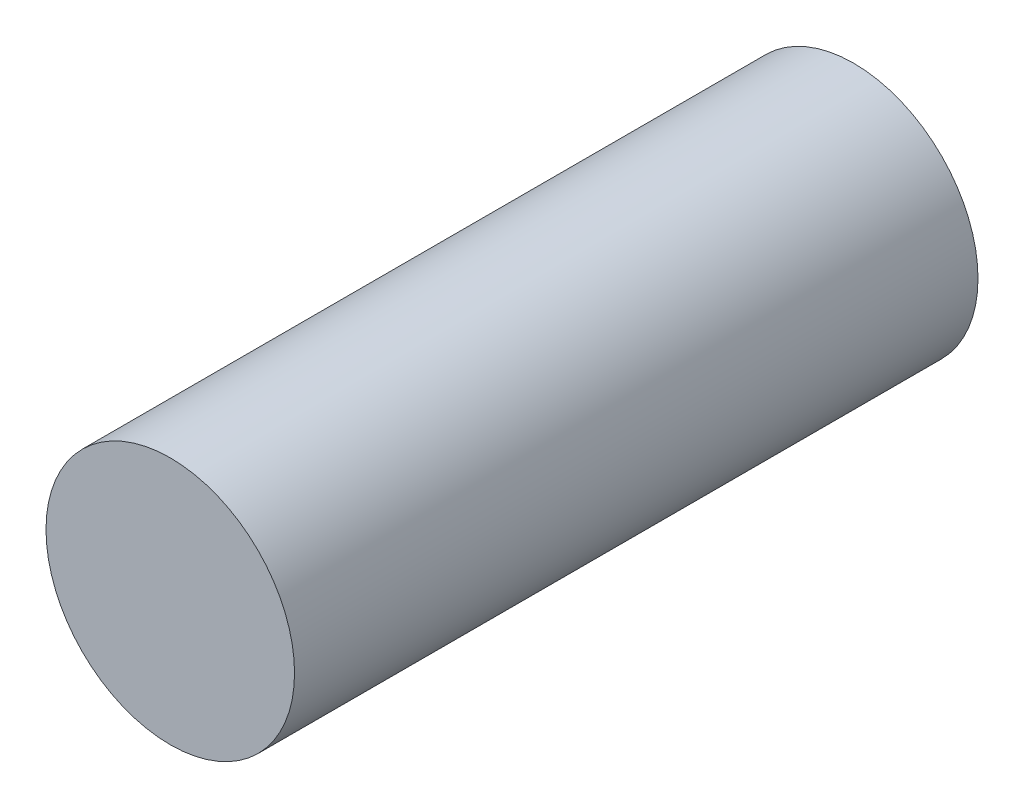
ISO-10303-21;
HEADER;
FILE_DESCRIPTION(('STEP AP214'),'2;1');
FILE_NAME('part.step','',(''),(''),'','','');
FILE_SCHEMA(('AUTOMOTIVE_DESIGN { 1 0 10303 214 1 1 1 1 }'));
ENDSEC;
DATA;
#1=APPLICATION_CONTEXT('core data for automotive mechanical design processes');
#2=APPLICATION_PROTOCOL_DEFINITION('international standard','automotive_design',2000,#1);
#3=PRODUCT_CONTEXT('',#1,'mechanical');
#4=PRODUCT('Part','Part','',(#3));
#5=PRODUCT_RELATED_PRODUCT_CATEGORY('part','',(#4));
#6=PRODUCT_DEFINITION_FORMATION('','',#4);
#7=PRODUCT_DEFINITION_CONTEXT('part definition',#1,'design');
#8=PRODUCT_DEFINITION('design','',#6,#7);
#9=PRODUCT_DEFINITION_SHAPE('','',#8);
#10=(LENGTH_UNIT() NAMED_UNIT(*) SI_UNIT(.MILLI.,.METRE.));
#11=(NAMED_UNIT(*) PLANE_ANGLE_UNIT() SI_UNIT($,.RADIAN.));
#12=(NAMED_UNIT(*) SI_UNIT($,.STERADIAN.) SOLID_ANGLE_UNIT());
#13=UNCERTAINTY_MEASURE_WITH_UNIT(LENGTH_MEASURE(1.E-05),#10,'distance_accuracy_value','');
#14=(GEOMETRIC_REPRESENTATION_CONTEXT(3) GLOBAL_UNCERTAINTY_ASSIGNED_CONTEXT((#13)) GLOBAL_UNIT_ASSIGNED_CONTEXT((#10,
#11,#12)) REPRESENTATION_CONTEXT('',''));
#15=CARTESIAN_POINT('',(0.,0.,0.));
#16=DIRECTION('',(0.,0.,1.));
#17=DIRECTION('',(1.,0.,0.));
#18=AXIS2_PLACEMENT_3D('',#15,#16,#17);
#19=CARTESIAN_POINT('',(0.,0.,11.));
#20=DIRECTION('',(0.,0.,-1.));
#21=DIRECTION('',(-1.,0.,0.));
#22=AXIS2_PLACEMENT_3D('',#19,#20,#21);
#23=CYLINDRICAL_SURFACE('',#22,2.);
#24=CARTESIAN_POINT('',(0.,0.,11.));
#25=DIRECTION('',(0.,0.,1.));
#26=DIRECTION('',(1.,0.,0.));
#27=AXIS2_PLACEMENT_3D('',#24,#25,#26);
#28=CIRCLE('',#27,2.);
#29=CARTESIAN_POINT('',(2.,0.,11.));
#30=VERTEX_POINT('',#29);
#31=EDGE_CURVE('E10',#30,#30,#28,.T.);
#32=ORIENTED_EDGE('',*,*,#31,.F.);
#33=EDGE_LOOP('',(#32));
#34=FACE_BOUND('',#33,.T.);
#35=CARTESIAN_POINT('',(0.,0.,0.));
#36=DIRECTION('',(0.,0.,1.));
#37=DIRECTION('',(1.,0.,0.));
#38=AXIS2_PLACEMENT_3D('',#35,#36,#37);
#39=CIRCLE('',#38,2.);
#40=CARTESIAN_POINT('',(2.,0.,0.));
#41=VERTEX_POINT('',#40);
#42=EDGE_CURVE('E33',#41,#41,#39,.T.);
#43=ORIENTED_EDGE('',*,*,#42,.T.);
#44=EDGE_LOOP('',(#43));
#45=FACE_BOUND('',#44,.T.);
#46=ADVANCED_FACE('F30',(#34,#45),#23,.T.);
#47=CARTESIAN_POINT('',(0.,0.,11.));
#48=DIRECTION('',(0.,0.,1.));
#49=DIRECTION('',(1.,0.,0.));
#50=AXIS2_PLACEMENT_3D('',#47,#48,#49);
#51=PLANE('',#50);
#52=ORIENTED_EDGE('',*,*,#31,.T.);
#53=EDGE_LOOP('',(#52));
#54=FACE_BOUND('',#53,.T.);
#55=ADVANCED_FACE('F45',(#54),#51,.T.);
#56=CARTESIAN_POINT('',(0.,0.,0.));
#57=DIRECTION('',(0.,0.,1.));
#58=DIRECTION('',(1.,0.,0.));
#59=AXIS2_PLACEMENT_3D('',#56,#57,#58);
#60=PLANE('',#59);
#61=ORIENTED_EDGE('',*,*,#42,.F.);
#62=EDGE_LOOP('',(#61));
#63=FACE_BOUND('',#62,.T.);
#64=ADVANCED_FACE('F43',(#63),#60,.F.);
#65=CLOSED_SHELL('',(#46,#55,#64));
#66=MANIFOLD_SOLID_BREP('B2',#65);
#67=ADVANCED_BREP_SHAPE_REPRESENTATION('',(#18,#66),#14);
#68=SHAPE_DEFINITION_REPRESENTATION(#9,#67);
ENDSEC;
END-ISO-10303-21;
